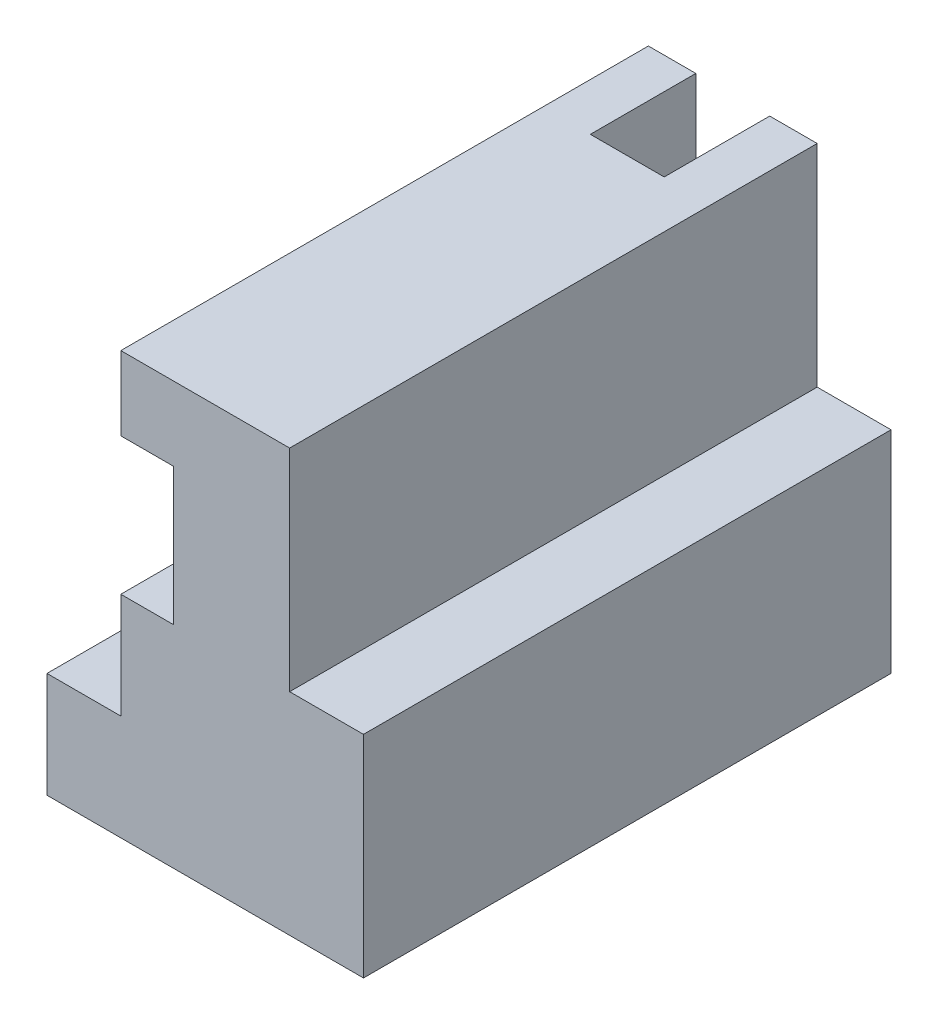
ISO-10303-21;
HEADER;
FILE_DESCRIPTION(('STEP AP214'),'2;1');
FILE_NAME('part.step','',(''),(''),'','','');
FILE_SCHEMA(('AUTOMOTIVE_DESIGN { 1 0 10303 214 1 1 1 1 }'));
ENDSEC;
DATA;
#1=APPLICATION_CONTEXT('core data for automotive mechanical design processes');
#2=APPLICATION_PROTOCOL_DEFINITION('international standard','automotive_design',2000,#1);
#3=PRODUCT_CONTEXT('',#1,'mechanical');
#4=PRODUCT('Part','Part','',(#3));
#5=PRODUCT_RELATED_PRODUCT_CATEGORY('part','',(#4));
#6=PRODUCT_DEFINITION_FORMATION('','',#4);
#7=PRODUCT_DEFINITION_CONTEXT('part definition',#1,'design');
#8=PRODUCT_DEFINITION('design','',#6,#7);
#9=PRODUCT_DEFINITION_SHAPE('','',#8);
#10=(LENGTH_UNIT() NAMED_UNIT(*) SI_UNIT(.MILLI.,.METRE.));
#11=(NAMED_UNIT(*) PLANE_ANGLE_UNIT() SI_UNIT($,.RADIAN.));
#12=(NAMED_UNIT(*) SI_UNIT($,.STERADIAN.) SOLID_ANGLE_UNIT());
#13=UNCERTAINTY_MEASURE_WITH_UNIT(LENGTH_MEASURE(1.E-05),#10,'distance_accuracy_value','');
#14=(GEOMETRIC_REPRESENTATION_CONTEXT(3) GLOBAL_UNCERTAINTY_ASSIGNED_CONTEXT((#13)) GLOBAL_UNIT_ASSIGNED_CONTEXT((#10,
#11,#12)) REPRESENTATION_CONTEXT('',''));
#15=CARTESIAN_POINT('',(0.,0.,0.));
#16=DIRECTION('',(0.,0.,1.));
#17=DIRECTION('',(1.,0.,0.));
#18=AXIS2_PLACEMENT_3D('',#15,#16,#17);
#19=CARTESIAN_POINT('',(0.,20.,50.));
#20=DIRECTION('',(0.,1.,0.));
#21=DIRECTION('',(0.,0.,1.));
#22=AXIS2_PLACEMENT_3D('',#19,#20,#21);
#23=PLANE('',#22);
#24=DIRECTION('',(1.,0.,0.));
#25=VECTOR('',#24,1.);
#26=CARTESIAN_POINT('',(0.,20.,0.));
#27=LINE('',#26,#25);
#28=CARTESIAN_POINT('',(3.5,20.,0.));
#29=VERTEX_POINT('',#28);
#30=CARTESIAN_POINT('',(8.,20.,0.));
#31=VERTEX_POINT('',#30);
#32=EDGE_CURVE('E281',#29,#31,#27,.T.);
#33=ORIENTED_EDGE('',*,*,#32,.F.);
#34=DIRECTION('',(0.,0.,-1.));
#35=VECTOR('',#34,1.);
#36=CARTESIAN_POINT('',(3.5,20.,10.));
#37=LINE('',#36,#35);
#38=CARTESIAN_POINT('',(3.5,20.,10.));
#39=VERTEX_POINT('',#38);
#40=EDGE_CURVE('E240',#39,#29,#37,.T.);
#41=ORIENTED_EDGE('',*,*,#40,.F.);
#42=DIRECTION('',(1.,0.,0.));
#43=VECTOR('',#42,1.);
#44=CARTESIAN_POINT('',(0.,20.,10.));
#45=LINE('',#44,#43);
#46=CARTESIAN_POINT('',(-3.5,20.,10.));
#47=VERTEX_POINT('',#46);
#48=EDGE_CURVE('E221',#47,#39,#45,.T.);
#49=ORIENTED_EDGE('',*,*,#48,.F.);
#50=DIRECTION('',(0.,0.,-1.));
#51=VECTOR('',#50,1.);
#52=CARTESIAN_POINT('',(-3.5,20.,10.));
#53=LINE('',#52,#51);
#54=CARTESIAN_POINT('',(-3.5,20.,0.));
#55=VERTEX_POINT('',#54);
#56=EDGE_CURVE('E243',#47,#55,#53,.T.);
#57=ORIENTED_EDGE('',*,*,#56,.T.);
#58=CARTESIAN_POINT('',(-8.,20.,0.));
#59=VERTEX_POINT('',#58);
#60=EDGE_CURVE('E282',#59,#55,#27,.T.);
#61=ORIENTED_EDGE('',*,*,#60,.F.);
#62=DIRECTION('',(0.,0.,-1.));
#63=VECTOR('',#62,1.);
#64=CARTESIAN_POINT('',(-8.,20.,50.));
#65=LINE('',#64,#63);
#66=CARTESIAN_POINT('',(-8.,20.,50.));
#67=VERTEX_POINT('',#66);
#68=EDGE_CURVE('E44',#67,#59,#65,.T.);
#69=ORIENTED_EDGE('',*,*,#68,.F.);
#70=DIRECTION('',(1.,0.,0.));
#71=VECTOR('',#70,1.);
#72=CARTESIAN_POINT('',(0.,20.,50.));
#73=LINE('',#72,#71);
#74=CARTESIAN_POINT('',(8.,20.,50.));
#75=VERTEX_POINT('',#74);
#76=EDGE_CURVE('E260',#67,#75,#73,.T.);
#77=ORIENTED_EDGE('',*,*,#76,.T.);
#78=DIRECTION('',(0.,0.,-1.));
#79=VECTOR('',#78,1.);
#80=CARTESIAN_POINT('',(8.,20.,50.));
#81=LINE('',#80,#79);
#82=EDGE_CURVE('E11',#75,#31,#81,.T.);
#83=ORIENTED_EDGE('',*,*,#82,.T.);
#84=EDGE_LOOP('',(#33,#41,#49,#57,#61,#69,#77,#83));
#85=FACE_BOUND('',#84,.T.);
#86=ADVANCED_FACE('F36',(#85),#23,.T.);
#87=CARTESIAN_POINT('',(0.,0.,0.));
#88=DIRECTION('',(0.,0.,1.));
#89=DIRECTION('',(1.,0.,0.));
#90=AXIS2_PLACEMENT_3D('',#87,#88,#89);
#91=PLANE('',#90);
#92=DIRECTION('',(0.,1.,0.));
#93=VECTOR('',#92,1.);
#94=CARTESIAN_POINT('',(3.5,0.,0.));
#95=LINE('',#94,#93);
#96=CARTESIAN_POINT('',(3.5,-15.,0.));
#97=VERTEX_POINT('',#96);
#98=EDGE_CURVE('E59',#97,#29,#95,.T.);
#99=ORIENTED_EDGE('',*,*,#98,.T.);
#100=ORIENTED_EDGE('',*,*,#32,.T.);
#101=DIRECTION('',(0.,1.,0.));
#102=VECTOR('',#101,1.);
#103=CARTESIAN_POINT('',(8.,0.,0.));
#104=LINE('',#103,#102);
#105=CARTESIAN_POINT('',(8.,0.,0.));
#106=VERTEX_POINT('',#105);
#107=EDGE_CURVE('E242',#106,#31,#104,.T.);
#108=ORIENTED_EDGE('',*,*,#107,.F.);
#109=DIRECTION('',(1.,0.,0.));
#110=VECTOR('',#109,1.);
#111=CARTESIAN_POINT('',(0.,0.,0.));
#112=LINE('',#111,#110);
#113=CARTESIAN_POINT('',(15.,0.,0.));
#114=VERTEX_POINT('',#113);
#115=EDGE_CURVE('E261',#106,#114,#112,.T.);
#116=ORIENTED_EDGE('',*,*,#115,.T.);
#117=DIRECTION('',(0.,1.,0.));
#118=VECTOR('',#117,1.);
#119=CARTESIAN_POINT('',(15.,0.,0.));
#120=LINE('',#119,#118);
#121=CARTESIAN_POINT('',(15.,-20.,0.));
#122=VERTEX_POINT('',#121);
#123=EDGE_CURVE('E297',#122,#114,#120,.T.);
#124=ORIENTED_EDGE('',*,*,#123,.F.);
#125=DIRECTION('',(1.,0.,0.));
#126=VECTOR('',#125,1.);
#127=CARTESIAN_POINT('',(0.,-20.,0.));
#128=LINE('',#127,#126);
#129=CARTESIAN_POINT('',(10.,-20.,0.));
#130=VERTEX_POINT('',#129);
#131=EDGE_CURVE('E293',#130,#122,#128,.T.);
#132=ORIENTED_EDGE('',*,*,#131,.F.);
#133=DIRECTION('',(0.,1.,0.));
#134=VECTOR('',#133,1.);
#135=CARTESIAN_POINT('',(10.,0.,0.));
#136=LINE('',#135,#134);
#137=CARTESIAN_POINT('',(10.,-15.,0.));
#138=VERTEX_POINT('',#137);
#139=EDGE_CURVE('E230',#130,#138,#136,.T.);
#140=ORIENTED_EDGE('',*,*,#139,.T.);
#141=DIRECTION('',(-1.,0.,0.));
#142=VECTOR('',#141,1.);
#143=CARTESIAN_POINT('',(0.,-15.,0.));
#144=LINE('',#143,#142);
#145=EDGE_CURVE('E226',#138,#97,#144,.T.);
#146=ORIENTED_EDGE('',*,*,#145,.T.);
#147=EDGE_LOOP('',(#99,#100,#108,#116,#124,#132,#140,#146));
#148=FACE_BOUND('',#147,.T.);
#149=ADVANCED_FACE('F380',(#148),#91,.F.);
#150=CARTESIAN_POINT('',(8.,0.,50.));
#151=DIRECTION('',(-1.,0.,0.));
#152=DIRECTION('',(0.,-1.,0.));
#153=AXIS2_PLACEMENT_3D('',#150,#151,#152);
#154=PLANE('',#153);
#155=ORIENTED_EDGE('',*,*,#107,.T.);
#156=ORIENTED_EDGE('',*,*,#82,.F.);
#157=DIRECTION('',(0.,1.,0.));
#158=VECTOR('',#157,1.);
#159=CARTESIAN_POINT('',(8.,0.,50.));
#160=LINE('',#159,#158);
#161=CARTESIAN_POINT('',(8.,0.,50.));
#162=VERTEX_POINT('',#161);
#163=EDGE_CURVE('E258',#162,#75,#160,.T.);
#164=ORIENTED_EDGE('',*,*,#163,.F.);
#165=DIRECTION('',(0.,0.,-1.));
#166=VECTOR('',#165,1.);
#167=CARTESIAN_POINT('',(8.,0.,50.));
#168=LINE('',#167,#166);
#169=EDGE_CURVE('E278',#162,#106,#168,.T.);
#170=ORIENTED_EDGE('',*,*,#169,.T.);
#171=EDGE_LOOP('',(#155,#156,#164,#170));
#172=FACE_BOUND('',#171,.T.);
#173=ADVANCED_FACE('F38',(#172),#154,.F.);
#174=CARTESIAN_POINT('',(-8.,0.,50.));
#175=DIRECTION('',(1.,0.,0.));
#176=DIRECTION('',(0.,1.,0.));
#177=AXIS2_PLACEMENT_3D('',#174,#175,#176);
#178=PLANE('',#177);
#179=DIRECTION('',(0.,-1.,0.));
#180=VECTOR('',#179,1.);
#181=CARTESIAN_POINT('',(-8.,0.,50.));
#182=LINE('',#181,#180);
#183=CARTESIAN_POINT('',(-8.,0.,50.));
#184=VERTEX_POINT('',#183);
#185=CARTESIAN_POINT('',(-8.,-10.,50.));
#186=VERTEX_POINT('',#185);
#187=EDGE_CURVE('E264',#184,#186,#182,.T.);
#188=ORIENTED_EDGE('',*,*,#187,.F.);
#189=DIRECTION('',(0.,0.,1.));
#190=VECTOR('',#189,1.);
#191=CARTESIAN_POINT('',(-8.,0.,50.));
#192=LINE('',#191,#190);
#193=CARTESIAN_POINT('',(-8.,0.,42.));
#194=VERTEX_POINT('',#193);
#195=EDGE_CURVE('E190',#194,#184,#192,.T.);
#196=ORIENTED_EDGE('',*,*,#195,.F.);
#197=DIRECTION('',(0.,-1.,0.));
#198=VECTOR('',#197,1.);
#199=CARTESIAN_POINT('',(-8.,13.,42.));
#200=LINE('',#199,#198);
#201=CARTESIAN_POINT('',(-8.,13.,42.));
#202=VERTEX_POINT('',#201);
#203=EDGE_CURVE('E363',#202,#194,#200,.T.);
#204=ORIENTED_EDGE('',*,*,#203,.F.);
#205=DIRECTION('',(0.,0.,-1.));
#206=VECTOR('',#205,1.);
#207=CARTESIAN_POINT('',(-8.,13.,50.));
#208=LINE('',#207,#206);
#209=CARTESIAN_POINT('',(-8.,13.,50.));
#210=VERTEX_POINT('',#209);
#211=EDGE_CURVE('E366',#210,#202,#208,.T.);
#212=ORIENTED_EDGE('',*,*,#211,.F.);
#213=EDGE_CURVE('E196',#67,#210,#182,.T.);
#214=ORIENTED_EDGE('',*,*,#213,.F.);
#215=ORIENTED_EDGE('',*,*,#68,.T.);
#216=DIRECTION('',(0.,-1.,0.));
#217=VECTOR('',#216,1.);
#218=CARTESIAN_POINT('',(-8.,0.,0.));
#219=LINE('',#218,#217);
#220=CARTESIAN_POINT('',(-8.,-10.,0.));
#221=VERTEX_POINT('',#220);
#222=EDGE_CURVE('E285',#59,#221,#219,.T.);
#223=ORIENTED_EDGE('',*,*,#222,.T.);
#224=DIRECTION('',(0.,0.,-1.));
#225=VECTOR('',#224,1.);
#226=CARTESIAN_POINT('',(-8.,-10.,50.));
#227=LINE('',#226,#225);
#228=EDGE_CURVE('E312',#186,#221,#227,.T.);
#229=ORIENTED_EDGE('',*,*,#228,.F.);
#230=EDGE_LOOP('',(#188,#196,#204,#212,#214,#215,#223,#229));
#231=FACE_BOUND('',#230,.T.);
#232=ADVANCED_FACE('F317',(#231),#178,.F.);
#233=CARTESIAN_POINT('',(0.,-10.,50.));
#234=DIRECTION('',(0.,-1.,0.));
#235=DIRECTION('',(0.,0.,-1.));
#236=AXIS2_PLACEMENT_3D('',#233,#234,#235);
#237=PLANE('',#236);
#238=DIRECTION('',(-1.,0.,0.));
#239=VECTOR('',#238,1.);
#240=CARTESIAN_POINT('',(0.,-10.,0.));
#241=LINE('',#240,#239);
#242=CARTESIAN_POINT('',(-15.,-10.,0.));
#243=VERTEX_POINT('',#242);
#244=EDGE_CURVE('E287',#221,#243,#241,.T.);
#245=ORIENTED_EDGE('',*,*,#244,.T.);
#246=DIRECTION('',(0.,0.,-1.));
#247=VECTOR('',#246,1.);
#248=CARTESIAN_POINT('',(-15.,-10.,50.));
#249=LINE('',#248,#247);
#250=CARTESIAN_POINT('',(-15.,-10.,50.));
#251=VERTEX_POINT('',#250);
#252=EDGE_CURVE('E310',#251,#243,#249,.T.);
#253=ORIENTED_EDGE('',*,*,#252,.F.);
#254=DIRECTION('',(-1.,0.,0.));
#255=VECTOR('',#254,1.);
#256=CARTESIAN_POINT('',(0.,-10.,50.));
#257=LINE('',#256,#255);
#258=EDGE_CURVE('E266',#186,#251,#257,.T.);
#259=ORIENTED_EDGE('',*,*,#258,.F.);
#260=ORIENTED_EDGE('',*,*,#228,.T.);
#261=EDGE_LOOP('',(#245,#253,#259,#260));
#262=FACE_BOUND('',#261,.T.);
#263=ADVANCED_FACE('F356',(#262),#237,.F.);
#264=CARTESIAN_POINT('',(-15.,0.,50.));
#265=DIRECTION('',(-1.,0.,0.));
#266=DIRECTION('',(0.,0.,1.));
#267=AXIS2_PLACEMENT_3D('',#264,#265,#266);
#268=PLANE('',#267);
#269=DIRECTION('',(0.,1.,0.));
#270=VECTOR('',#269,1.);
#271=CARTESIAN_POINT('',(-15.,0.,0.));
#272=LINE('',#271,#270);
#273=CARTESIAN_POINT('',(-15.,-20.,0.));
#274=VERTEX_POINT('',#273);
#275=EDGE_CURVE('E290',#274,#243,#272,.T.);
#276=ORIENTED_EDGE('',*,*,#275,.F.);
#277=DIRECTION('',(0.,0.,-1.));
#278=VECTOR('',#277,1.);
#279=CARTESIAN_POINT('',(-15.,-20.,50.));
#280=LINE('',#279,#278);
#281=CARTESIAN_POINT('',(-15.,-20.,50.));
#282=VERTEX_POINT('',#281);
#283=EDGE_CURVE('E308',#282,#274,#280,.T.);
#284=ORIENTED_EDGE('',*,*,#283,.F.);
#285=DIRECTION('',(0.,1.,0.));
#286=VECTOR('',#285,1.);
#287=CARTESIAN_POINT('',(-15.,0.,50.));
#288=LINE('',#287,#286);
#289=EDGE_CURVE('E268',#282,#251,#288,.T.);
#290=ORIENTED_EDGE('',*,*,#289,.T.);
#291=ORIENTED_EDGE('',*,*,#252,.T.);
#292=EDGE_LOOP('',(#276,#284,#290,#291));
#293=FACE_BOUND('',#292,.T.);
#294=ADVANCED_FACE('F352',(#293),#268,.T.);
#295=CARTESIAN_POINT('',(0.,-20.,50.));
#296=DIRECTION('',(0.,1.,0.));
#297=DIRECTION('',(0.,0.,1.));
#298=AXIS2_PLACEMENT_3D('',#295,#296,#297);
#299=PLANE('',#298);
#300=CARTESIAN_POINT('',(-10.,-20.,0.));
#301=VERTEX_POINT('',#300);
#302=EDGE_CURVE('E294',#274,#301,#128,.T.);
#303=ORIENTED_EDGE('',*,*,#302,.T.);
#304=DIRECTION('',(0.,0.,-1.));
#305=VECTOR('',#304,1.);
#306=CARTESIAN_POINT('',(-10.,-20.,10.));
#307=LINE('',#306,#305);
#308=CARTESIAN_POINT('',(-10.,-20.,10.));
#309=VERTEX_POINT('',#308);
#310=EDGE_CURVE('E250',#309,#301,#307,.T.);
#311=ORIENTED_EDGE('',*,*,#310,.F.);
#312=DIRECTION('',(-1.,0.,0.));
#313=VECTOR('',#312,1.);
#314=CARTESIAN_POINT('',(0.,-20.,10.));
#315=LINE('',#314,#313);
#316=CARTESIAN_POINT('',(10.,-20.,10.));
#317=VERTEX_POINT('',#316);
#318=EDGE_CURVE('E210',#317,#309,#315,.T.);
#319=ORIENTED_EDGE('',*,*,#318,.F.);
#320=DIRECTION('',(0.,0.,-1.));
#321=VECTOR('',#320,1.);
#322=CARTESIAN_POINT('',(10.,-20.,10.));
#323=LINE('',#322,#321);
#324=EDGE_CURVE('E252',#317,#130,#323,.T.);
#325=ORIENTED_EDGE('',*,*,#324,.T.);
#326=ORIENTED_EDGE('',*,*,#131,.T.);
#327=DIRECTION('',(0.,0.,-1.));
#328=VECTOR('',#327,1.);
#329=CARTESIAN_POINT('',(15.,-20.,50.));
#330=LINE('',#329,#328);
#331=CARTESIAN_POINT('',(15.,-20.,50.));
#332=VERTEX_POINT('',#331);
#333=EDGE_CURVE('E305',#332,#122,#330,.T.);
#334=ORIENTED_EDGE('',*,*,#333,.F.);
#335=DIRECTION('',(1.,0.,0.));
#336=VECTOR('',#335,1.);
#337=CARTESIAN_POINT('',(0.,-20.,50.));
#338=LINE('',#337,#336);
#339=EDGE_CURVE('E271',#282,#332,#338,.T.);
#340=ORIENTED_EDGE('',*,*,#339,.F.);
#341=ORIENTED_EDGE('',*,*,#283,.T.);
#342=EDGE_LOOP('',(#303,#311,#319,#325,#326,#334,#340,#341));
#343=FACE_BOUND('',#342,.T.);
#344=ADVANCED_FACE('F346',(#343),#299,.F.);
#345=CARTESIAN_POINT('',(15.,0.,50.));
#346=DIRECTION('',(-1.,0.,0.));
#347=DIRECTION('',(0.,0.,1.));
#348=AXIS2_PLACEMENT_3D('',#345,#346,#347);
#349=PLANE('',#348);
#350=ORIENTED_EDGE('',*,*,#123,.T.);
#351=DIRECTION('',(0.,0.,-1.));
#352=VECTOR('',#351,1.);
#353=CARTESIAN_POINT('',(15.,0.,50.));
#354=LINE('',#353,#352);
#355=CARTESIAN_POINT('',(15.,0.,50.));
#356=VERTEX_POINT('',#355);
#357=EDGE_CURVE('E303',#356,#114,#354,.T.);
#358=ORIENTED_EDGE('',*,*,#357,.F.);
#359=DIRECTION('',(0.,1.,0.));
#360=VECTOR('',#359,1.);
#361=CARTESIAN_POINT('',(15.,0.,50.));
#362=LINE('',#361,#360);
#363=EDGE_CURVE('E273',#332,#356,#362,.T.);
#364=ORIENTED_EDGE('',*,*,#363,.F.);
#365=ORIENTED_EDGE('',*,*,#333,.T.);
#366=EDGE_LOOP('',(#350,#358,#364,#365));
#367=FACE_BOUND('',#366,.T.);
#368=ADVANCED_FACE('F395',(#367),#349,.F.);
#369=CARTESIAN_POINT('',(0.,0.,50.));
#370=DIRECTION('',(0.,1.,0.));
#371=DIRECTION('',(-1.,0.,0.));
#372=AXIS2_PLACEMENT_3D('',#369,#370,#371);
#373=PLANE('',#372);
#374=ORIENTED_EDGE('',*,*,#115,.F.);
#375=ORIENTED_EDGE('',*,*,#169,.F.);
#376=DIRECTION('',(1.,0.,0.));
#377=VECTOR('',#376,1.);
#378=CARTESIAN_POINT('',(0.,0.,50.));
#379=LINE('',#378,#377);
#380=EDGE_CURVE('E275',#162,#356,#379,.T.);
#381=ORIENTED_EDGE('',*,*,#380,.T.);
#382=ORIENTED_EDGE('',*,*,#357,.T.);
#383=EDGE_LOOP('',(#374,#375,#381,#382));
#384=FACE_BOUND('',#383,.T.);
#385=ADVANCED_FACE('F398',(#384),#373,.T.);
#386=CARTESIAN_POINT('',(0.,0.,50.));
#387=DIRECTION('',(0.,0.,1.));
#388=DIRECTION('',(1.,0.,0.));
#389=AXIS2_PLACEMENT_3D('',#386,#387,#388);
#390=PLANE('',#389);
#391=DIRECTION('',(-1.,0.,0.));
#392=VECTOR('',#391,1.);
#393=CARTESIAN_POINT('',(-3.,0.,50.));
#394=LINE('',#393,#392);
#395=CARTESIAN_POINT('',(-3.,0.,50.));
#396=VERTEX_POINT('',#395);
#397=EDGE_CURVE('E227',#396,#184,#394,.T.);
#398=ORIENTED_EDGE('',*,*,#397,.T.);
#399=ORIENTED_EDGE('',*,*,#187,.T.);
#400=ORIENTED_EDGE('',*,*,#258,.T.);
#401=ORIENTED_EDGE('',*,*,#289,.F.);
#402=ORIENTED_EDGE('',*,*,#339,.T.);
#403=ORIENTED_EDGE('',*,*,#363,.T.);
#404=ORIENTED_EDGE('',*,*,#380,.F.);
#405=ORIENTED_EDGE('',*,*,#163,.T.);
#406=ORIENTED_EDGE('',*,*,#76,.F.);
#407=ORIENTED_EDGE('',*,*,#213,.T.);
#408=DIRECTION('',(-1.,0.,0.));
#409=VECTOR('',#408,1.);
#410=CARTESIAN_POINT('',(-3.,13.,50.));
#411=LINE('',#410,#409);
#412=CARTESIAN_POINT('',(-3.,13.,50.));
#413=VERTEX_POINT('',#412);
#414=EDGE_CURVE('E179',#413,#210,#411,.T.);
#415=ORIENTED_EDGE('',*,*,#414,.F.);
#416=DIRECTION('',(0.,1.,0.));
#417=VECTOR('',#416,1.);
#418=CARTESIAN_POINT('',(-3.,13.,50.));
#419=LINE('',#418,#417);
#420=EDGE_CURVE('E184',#396,#413,#419,.T.);
#421=ORIENTED_EDGE('',*,*,#420,.F.);
#422=EDGE_LOOP('',(#398,#399,#400,#401,#402,#403,#404,#405,#406,#407,#415,#421));
#423=FACE_BOUND('',#422,.T.);
#424=ADVANCED_FACE('F193',(#423),#390,.T.);
#425=ORIENTED_EDGE('',*,*,#60,.T.);
#426=DIRECTION('',(0.,1.,0.));
#427=VECTOR('',#426,1.);
#428=CARTESIAN_POINT('',(-3.5,0.,0.));
#429=LINE('',#428,#427);
#430=CARTESIAN_POINT('',(-3.5,-15.,0.));
#431=VERTEX_POINT('',#430);
#432=EDGE_CURVE('E206',#431,#55,#429,.T.);
#433=ORIENTED_EDGE('',*,*,#432,.F.);
#434=DIRECTION('',(-1.,0.,0.));
#435=VECTOR('',#434,1.);
#436=CARTESIAN_POINT('',(0.,-15.,0.));
#437=LINE('',#436,#435);
#438=CARTESIAN_POINT('',(-10.,-15.,0.));
#439=VERTEX_POINT('',#438);
#440=EDGE_CURVE('E236',#431,#439,#437,.T.);
#441=ORIENTED_EDGE('',*,*,#440,.T.);
#442=DIRECTION('',(0.,1.,0.));
#443=VECTOR('',#442,1.);
#444=CARTESIAN_POINT('',(-10.,0.,0.));
#445=LINE('',#444,#443);
#446=EDGE_CURVE('E233',#301,#439,#445,.T.);
#447=ORIENTED_EDGE('',*,*,#446,.F.);
#448=ORIENTED_EDGE('',*,*,#302,.F.);
#449=ORIENTED_EDGE('',*,*,#275,.T.);
#450=ORIENTED_EDGE('',*,*,#244,.F.);
#451=ORIENTED_EDGE('',*,*,#222,.F.);
#452=EDGE_LOOP('',(#425,#433,#441,#447,#448,#449,#450,#451));
#453=FACE_BOUND('',#452,.T.);
#454=ADVANCED_FACE('F323',(#453),#91,.F.);
#455=CARTESIAN_POINT('',(3.5,0.,10.));
#456=DIRECTION('',(-1.,0.,0.));
#457=DIRECTION('',(0.,-1.,0.));
#458=AXIS2_PLACEMENT_3D('',#455,#456,#457);
#459=PLANE('',#458);
#460=ORIENTED_EDGE('',*,*,#98,.F.);
#461=DIRECTION('',(0.,0.,-1.));
#462=VECTOR('',#461,1.);
#463=CARTESIAN_POINT('',(3.5,-15.,10.));
#464=LINE('',#463,#462);
#465=CARTESIAN_POINT('',(3.5,-15.,10.));
#466=VERTEX_POINT('',#465);
#467=EDGE_CURVE('E224',#466,#97,#464,.T.);
#468=ORIENTED_EDGE('',*,*,#467,.F.);
#469=DIRECTION('',(0.,1.,0.));
#470=VECTOR('',#469,1.);
#471=CARTESIAN_POINT('',(3.5,0.,10.));
#472=LINE('',#471,#470);
#473=EDGE_CURVE('E203',#466,#39,#472,.T.);
#474=ORIENTED_EDGE('',*,*,#473,.T.);
#475=ORIENTED_EDGE('',*,*,#40,.T.);
#476=EDGE_LOOP('',(#460,#468,#474,#475));
#477=FACE_BOUND('',#476,.T.);
#478=ADVANCED_FACE('F404',(#477),#459,.T.);
#479=CARTESIAN_POINT('',(-3.5,0.,10.));
#480=DIRECTION('',(-1.,0.,0.));
#481=DIRECTION('',(0.,-1.,0.));
#482=AXIS2_PLACEMENT_3D('',#479,#480,#481);
#483=PLANE('',#482);
#484=ORIENTED_EDGE('',*,*,#432,.T.);
#485=ORIENTED_EDGE('',*,*,#56,.F.);
#486=DIRECTION('',(0.,1.,0.));
#487=VECTOR('',#486,1.);
#488=CARTESIAN_POINT('',(-3.5,0.,10.));
#489=LINE('',#488,#487);
#490=CARTESIAN_POINT('',(-3.5,-15.,10.));
#491=VERTEX_POINT('',#490);
#492=EDGE_CURVE('E218',#491,#47,#489,.T.);
#493=ORIENTED_EDGE('',*,*,#492,.F.);
#494=DIRECTION('',(0.,0.,-1.));
#495=VECTOR('',#494,1.);
#496=CARTESIAN_POINT('',(-3.5,-15.,10.));
#497=LINE('',#496,#495);
#498=EDGE_CURVE('E246',#491,#431,#497,.T.);
#499=ORIENTED_EDGE('',*,*,#498,.T.);
#500=EDGE_LOOP('',(#484,#485,#493,#499));
#501=FACE_BOUND('',#500,.T.);
#502=ADVANCED_FACE('F330',(#501),#483,.F.);
#503=CARTESIAN_POINT('',(0.,-15.,10.));
#504=DIRECTION('',(0.,-1.,0.));
#505=DIRECTION('',(0.,0.,-1.));
#506=AXIS2_PLACEMENT_3D('',#503,#504,#505);
#507=PLANE('',#506);
#508=ORIENTED_EDGE('',*,*,#440,.F.);
#509=ORIENTED_EDGE('',*,*,#498,.F.);
#510=DIRECTION('',(-1.,0.,0.));
#511=VECTOR('',#510,1.);
#512=CARTESIAN_POINT('',(0.,-15.,10.));
#513=LINE('',#512,#511);
#514=CARTESIAN_POINT('',(-10.,-15.,10.));
#515=VERTEX_POINT('',#514);
#516=EDGE_CURVE('E216',#491,#515,#513,.T.);
#517=ORIENTED_EDGE('',*,*,#516,.T.);
#518=DIRECTION('',(0.,0.,-1.));
#519=VECTOR('',#518,1.);
#520=CARTESIAN_POINT('',(-10.,-15.,10.));
#521=LINE('',#520,#519);
#522=EDGE_CURVE('E248',#515,#439,#521,.T.);
#523=ORIENTED_EDGE('',*,*,#522,.T.);
#524=EDGE_LOOP('',(#508,#509,#517,#523));
#525=FACE_BOUND('',#524,.T.);
#526=ADVANCED_FACE('F338',(#525),#507,.T.);
#527=CARTESIAN_POINT('',(-10.,0.,10.));
#528=DIRECTION('',(-1.,0.,0.));
#529=DIRECTION('',(0.,0.,1.));
#530=AXIS2_PLACEMENT_3D('',#527,#528,#529);
#531=PLANE('',#530);
#532=ORIENTED_EDGE('',*,*,#446,.T.);
#533=ORIENTED_EDGE('',*,*,#522,.F.);
#534=DIRECTION('',(0.,1.,0.));
#535=VECTOR('',#534,1.);
#536=CARTESIAN_POINT('',(-10.,0.,10.));
#537=LINE('',#536,#535);
#538=EDGE_CURVE('E213',#309,#515,#537,.T.);
#539=ORIENTED_EDGE('',*,*,#538,.F.);
#540=ORIENTED_EDGE('',*,*,#310,.T.);
#541=EDGE_LOOP('',(#532,#533,#539,#540));
#542=FACE_BOUND('',#541,.T.);
#543=ADVANCED_FACE('F340',(#542),#531,.F.);
#544=CARTESIAN_POINT('',(10.,0.,10.));
#545=DIRECTION('',(-1.,0.,0.));
#546=DIRECTION('',(0.,0.,1.));
#547=AXIS2_PLACEMENT_3D('',#544,#545,#546);
#548=PLANE('',#547);
#549=ORIENTED_EDGE('',*,*,#139,.F.);
#550=ORIENTED_EDGE('',*,*,#324,.F.);
#551=DIRECTION('',(0.,1.,0.));
#552=VECTOR('',#551,1.);
#553=CARTESIAN_POINT('',(10.,0.,10.));
#554=LINE('',#553,#552);
#555=CARTESIAN_POINT('',(10.,-15.,10.));
#556=VERTEX_POINT('',#555);
#557=EDGE_CURVE('E208',#317,#556,#554,.T.);
#558=ORIENTED_EDGE('',*,*,#557,.T.);
#559=DIRECTION('',(0.,0.,-1.));
#560=VECTOR('',#559,1.);
#561=CARTESIAN_POINT('',(10.,-15.,10.));
#562=LINE('',#561,#560);
#563=EDGE_CURVE('E255',#556,#138,#562,.T.);
#564=ORIENTED_EDGE('',*,*,#563,.T.);
#565=EDGE_LOOP('',(#549,#550,#558,#564));
#566=FACE_BOUND('',#565,.T.);
#567=ADVANCED_FACE('F412',(#566),#548,.T.);
#568=CARTESIAN_POINT('',(0.,-15.,10.));
#569=DIRECTION('',(0.,-1.,0.));
#570=DIRECTION('',(0.,0.,-1.));
#571=AXIS2_PLACEMENT_3D('',#568,#569,#570);
#572=PLANE('',#571);
#573=ORIENTED_EDGE('',*,*,#145,.F.);
#574=ORIENTED_EDGE('',*,*,#563,.F.);
#575=DIRECTION('',(-1.,0.,0.));
#576=VECTOR('',#575,1.);
#577=CARTESIAN_POINT('',(0.,-15.,10.));
#578=LINE('',#577,#576);
#579=EDGE_CURVE('E205',#556,#466,#578,.T.);
#580=ORIENTED_EDGE('',*,*,#579,.T.);
#581=ORIENTED_EDGE('',*,*,#467,.T.);
#582=EDGE_LOOP('',(#573,#574,#580,#581));
#583=FACE_BOUND('',#582,.T.);
#584=ADVANCED_FACE('F409',(#583),#572,.T.);
#585=CARTESIAN_POINT('',(0.,0.,10.));
#586=DIRECTION('',(0.,0.,-1.));
#587=DIRECTION('',(-1.,0.,0.));
#588=AXIS2_PLACEMENT_3D('',#585,#586,#587);
#589=PLANE('',#588);
#590=ORIENTED_EDGE('',*,*,#473,.F.);
#591=ORIENTED_EDGE('',*,*,#579,.F.);
#592=ORIENTED_EDGE('',*,*,#557,.F.);
#593=ORIENTED_EDGE('',*,*,#318,.T.);
#594=ORIENTED_EDGE('',*,*,#538,.T.);
#595=ORIENTED_EDGE('',*,*,#516,.F.);
#596=ORIENTED_EDGE('',*,*,#492,.T.);
#597=ORIENTED_EDGE('',*,*,#48,.T.);
#598=EDGE_LOOP('',(#590,#591,#592,#593,#594,#595,#596,#597));
#599=FACE_BOUND('',#598,.T.);
#600=ADVANCED_FACE('F334',(#599),#589,.T.);
#601=CARTESIAN_POINT('',(-3.,0.,50.));
#602=DIRECTION('',(0.,-1.,0.));
#603=DIRECTION('',(0.,0.,-1.));
#604=AXIS2_PLACEMENT_3D('',#601,#602,#603);
#605=PLANE('',#604);
#606=ORIENTED_EDGE('',*,*,#195,.T.);
#607=ORIENTED_EDGE('',*,*,#397,.F.);
#608=DIRECTION('',(0.,0.,1.));
#609=VECTOR('',#608,1.);
#610=CARTESIAN_POINT('',(-3.,0.,50.));
#611=LINE('',#610,#609);
#612=CARTESIAN_POINT('',(-3.,0.,42.));
#613=VERTEX_POINT('',#612);
#614=EDGE_CURVE('E51',#613,#396,#611,.T.);
#615=ORIENTED_EDGE('',*,*,#614,.F.);
#616=DIRECTION('',(-1.,0.,0.));
#617=VECTOR('',#616,1.);
#618=CARTESIAN_POINT('',(-3.,0.,42.));
#619=LINE('',#618,#617);
#620=EDGE_CURVE('E198',#613,#194,#619,.T.);
#621=ORIENTED_EDGE('',*,*,#620,.T.);
#622=EDGE_LOOP('',(#606,#607,#615,#621));
#623=FACE_BOUND('',#622,.T.);
#624=ADVANCED_FACE('F369',(#623),#605,.F.);
#625=CARTESIAN_POINT('',(-3.,13.,42.));
#626=DIRECTION('',(0.,0.,-1.));
#627=DIRECTION('',(-1.,0.,0.));
#628=AXIS2_PLACEMENT_3D('',#625,#626,#627);
#629=PLANE('',#628);
#630=ORIENTED_EDGE('',*,*,#203,.T.);
#631=ORIENTED_EDGE('',*,*,#620,.F.);
#632=DIRECTION('',(0.,-1.,0.));
#633=VECTOR('',#632,1.);
#634=CARTESIAN_POINT('',(-3.,13.,42.));
#635=LINE('',#634,#633);
#636=CARTESIAN_POINT('',(-3.,13.,42.));
#637=VERTEX_POINT('',#636);
#638=EDGE_CURVE('E183',#637,#613,#635,.T.);
#639=ORIENTED_EDGE('',*,*,#638,.F.);
#640=DIRECTION('',(-1.,0.,0.));
#641=VECTOR('',#640,1.);
#642=CARTESIAN_POINT('',(-3.,13.,42.));
#643=LINE('',#642,#641);
#644=EDGE_CURVE('E181',#637,#202,#643,.T.);
#645=ORIENTED_EDGE('',*,*,#644,.T.);
#646=EDGE_LOOP('',(#630,#631,#639,#645));
#647=FACE_BOUND('',#646,.T.);
#648=ADVANCED_FACE('F370',(#647),#629,.F.);
#649=CARTESIAN_POINT('',(-3.,13.,50.));
#650=DIRECTION('',(0.,1.,0.));
#651=DIRECTION('',(0.,0.,1.));
#652=AXIS2_PLACEMENT_3D('',#649,#650,#651);
#653=PLANE('',#652);
#654=ORIENTED_EDGE('',*,*,#211,.T.);
#655=ORIENTED_EDGE('',*,*,#644,.F.);
#656=DIRECTION('',(0.,0.,-1.));
#657=VECTOR('',#656,1.);
#658=CARTESIAN_POINT('',(-3.,13.,50.));
#659=LINE('',#658,#657);
#660=EDGE_CURVE('E175',#413,#637,#659,.T.);
#661=ORIENTED_EDGE('',*,*,#660,.F.);
#662=ORIENTED_EDGE('',*,*,#414,.T.);
#663=EDGE_LOOP('',(#654,#655,#661,#662));
#664=FACE_BOUND('',#663,.T.);
#665=ADVANCED_FACE('F177',(#664),#653,.F.);
#666=CARTESIAN_POINT('',(-3.,0.,0.));
#667=DIRECTION('',(1.,0.,0.));
#668=DIRECTION('',(0.,1.,0.));
#669=AXIS2_PLACEMENT_3D('',#666,#667,#668);
#670=PLANE('',#669);
#671=ORIENTED_EDGE('',*,*,#420,.T.);
#672=ORIENTED_EDGE('',*,*,#660,.T.);
#673=ORIENTED_EDGE('',*,*,#638,.T.);
#674=ORIENTED_EDGE('',*,*,#614,.T.);
#675=EDGE_LOOP('',(#671,#672,#673,#674));
#676=FACE_BOUND('',#675,.T.);
#677=ADVANCED_FACE('F187',(#676),#670,.F.);
#678=CLOSED_SHELL('',(#86,#149,#173,#232,#263,#294,#344,#368,#385,#424,#454,#478,#502,#526,#543,
#567,#584,#600,#624,#648,#665,#677));
#679=MANIFOLD_SOLID_BREP('B2',#678);
#680=ADVANCED_BREP_SHAPE_REPRESENTATION('',(#18,#679),#14);
#681=SHAPE_DEFINITION_REPRESENTATION(#9,#680);
ENDSEC;
END-ISO-10303-21;
